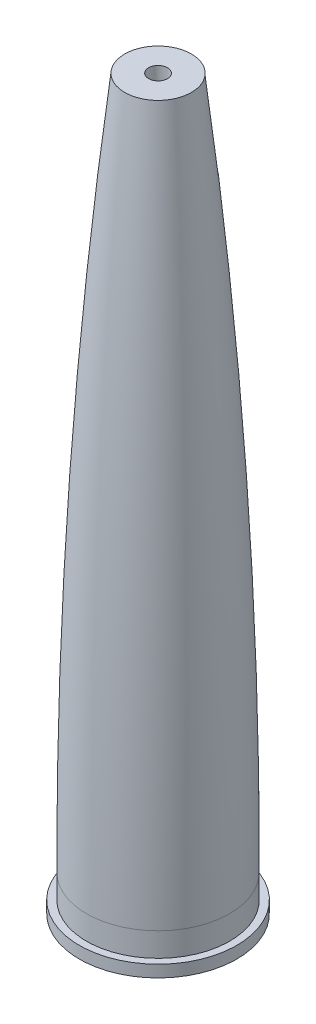
ISO-10303-21;
HEADER;
FILE_DESCRIPTION(('STEP AP214'),'2;1');
FILE_NAME('part.step','',(''),(''),'','','');
FILE_SCHEMA(('AUTOMOTIVE_DESIGN { 1 0 10303 214 1 1 1 1 }'));
ENDSEC;
DATA;
#1=APPLICATION_CONTEXT('core data for automotive mechanical design processes');
#2=APPLICATION_PROTOCOL_DEFINITION('international standard','automotive_design',2000,#1);
#3=PRODUCT_CONTEXT('',#1,'mechanical');
#4=PRODUCT('Part','Part','',(#3));
#5=PRODUCT_RELATED_PRODUCT_CATEGORY('part','',(#4));
#6=PRODUCT_DEFINITION_FORMATION('','',#4);
#7=PRODUCT_DEFINITION_CONTEXT('part definition',#1,'design');
#8=PRODUCT_DEFINITION('design','',#6,#7);
#9=PRODUCT_DEFINITION_SHAPE('','',#8);
#10=(LENGTH_UNIT() NAMED_UNIT(*) SI_UNIT(.MILLI.,.METRE.));
#11=(NAMED_UNIT(*) PLANE_ANGLE_UNIT() SI_UNIT($,.RADIAN.));
#12=(NAMED_UNIT(*) SI_UNIT($,.STERADIAN.) SOLID_ANGLE_UNIT());
#13=UNCERTAINTY_MEASURE_WITH_UNIT(LENGTH_MEASURE(1.E-05),#10,'distance_accuracy_value','');
#14=(GEOMETRIC_REPRESENTATION_CONTEXT(3) GLOBAL_UNCERTAINTY_ASSIGNED_CONTEXT((#13)) GLOBAL_UNIT_ASSIGNED_CONTEXT((#10,
#11,#12)) REPRESENTATION_CONTEXT('',''));
#15=CARTESIAN_POINT('',(0.,0.,0.));
#16=DIRECTION('',(0.,0.,1.));
#17=DIRECTION('',(1.,0.,0.));
#18=AXIS2_PLACEMENT_3D('',#15,#16,#17);
#19=CARTESIAN_POINT('',(-1.02594588578452E-12,469.437670106418,0.));
#20=DIRECTION('',(0.,1.,0.));
#21=DIRECTION('',(0.,0.,1.));
#22=AXIS2_PLACEMENT_3D('',#19,#20,#21);
#23=PLANE('',#22);
#24=CARTESIAN_POINT('',(0.,469.437670106418,0.));
#25=DIRECTION('',(0.,-1.,0.));
#26=DIRECTION('',(0.,0.,-1.));
#27=AXIS2_PLACEMENT_3D('',#24,#25,#26);
#28=CIRCLE('',#27,10.0812105045985);
#29=CARTESIAN_POINT('',(0.,469.437670106418,-10.0812105045985));
#30=VERTEX_POINT('',#29);
#31=EDGE_CURVE('E54',#30,#30,#28,.T.);
#32=ORIENTED_EDGE('',*,*,#31,.T.);
#33=EDGE_LOOP('',(#32));
#34=FACE_BOUND('',#33,.T.);
#35=CARTESIAN_POINT('',(0.,469.437670106418,0.));
#36=DIRECTION('',(0.,-1.,0.));
#37=DIRECTION('',(0.,0.,-1.));
#38=AXIS2_PLACEMENT_3D('',#35,#36,#37);
#39=CIRCLE('',#38,35.4812105045985);
#40=CARTESIAN_POINT('',(0.,469.437670106418,-35.4812105045985));
#41=VERTEX_POINT('',#40);
#42=EDGE_CURVE('E10',#41,#41,#39,.T.);
#43=ORIENTED_EDGE('',*,*,#42,.F.);
#44=EDGE_LOOP('',(#43));
#45=FACE_BOUND('',#44,.T.);
#46=ADVANCED_FACE('F29',(#34,#45),#23,.T.);
#47=CARTESIAN_POINT('',(0.,-256.393087278072,0.));
#48=DIRECTION('',(0.,-1.,0.));
#49=DIRECTION('',(0.,0.,-1.));
#50=AXIS2_PLACEMENT_3D('',#47,#48,#49);
#51=DEGENERATE_TOROIDAL_SURFACE('',#50,6411.86531511049,6488.07425279076,.F.);
#52=CARTESIAN_POINT('',(0.,-267.162329893582,0.));
#53=DIRECTION('',(0.,-1.,0.));
#54=DIRECTION('',(0.,0.,-1.));
#55=AXIS2_PLACEMENT_3D('',#52,#53,#54);
#56=CIRCLE('',#55,76.2);
#57=CARTESIAN_POINT('',(0.,-267.162329893582,-76.2));
#58=VERTEX_POINT('',#57);
#59=EDGE_CURVE('E35',#58,#58,#56,.T.);
#60=ORIENTED_EDGE('',*,*,#59,.F.);
#61=EDGE_LOOP('',(#60));
#62=FACE_BOUND('',#61,.T.);
#63=ORIENTED_EDGE('',*,*,#42,.T.);
#64=EDGE_LOOP('',(#63));
#65=FACE_BOUND('',#64,.T.);
#66=ADVANCED_FACE('F120',(#62,#65),#51,.F.);
#67=CARTESIAN_POINT('',(0.,0.,0.));
#68=DIRECTION('',(0.,-1.,0.));
#69=DIRECTION('',(0.,0.,-1.));
#70=AXIS2_PLACEMENT_3D('',#67,#68,#69);
#71=CYLINDRICAL_SURFACE('',#70,76.2);
#72=ORIENTED_EDGE('',*,*,#59,.T.);
#73=EDGE_LOOP('',(#72));
#74=FACE_BOUND('',#73,.T.);
#75=CARTESIAN_POINT('',(0.,-292.562329893582,0.));
#76=DIRECTION('',(0.,-1.,0.));
#77=DIRECTION('',(0.,0.,-1.));
#78=AXIS2_PLACEMENT_3D('',#75,#76,#77);
#79=CIRCLE('',#78,76.1999999999999);
#80=CARTESIAN_POINT('',(0.,-292.562329893582,-76.1999999999999));
#81=VERTEX_POINT('',#80);
#82=EDGE_CURVE('E39',#81,#81,#79,.T.);
#83=ORIENTED_EDGE('',*,*,#82,.F.);
#84=EDGE_LOOP('',(#83));
#85=FACE_BOUND('',#84,.T.);
#86=ADVANCED_FACE('F117',(#74,#85),#71,.T.);
#87=CARTESIAN_POINT('',(0.,-292.562329893582,0.));
#88=DIRECTION('',(0.,1.,0.));
#89=DIRECTION('',(0.,0.,1.));
#90=AXIS2_PLACEMENT_3D('',#87,#88,#89);
#91=PLANE('',#90);
#92=ORIENTED_EDGE('',*,*,#82,.T.);
#93=EDGE_LOOP('',(#92));
#94=FACE_BOUND('',#93,.T.);
#95=CARTESIAN_POINT('',(0.,-292.562329893582,0.));
#96=DIRECTION('',(0.,-1.,0.));
#97=DIRECTION('',(0.,0.,-1.));
#98=AXIS2_PLACEMENT_3D('',#95,#96,#97);
#99=CIRCLE('',#98,83.8199999999999);
#100=CARTESIAN_POINT('',(0.,-292.562329893582,-83.8199999999999));
#101=VERTEX_POINT('',#100);
#102=EDGE_CURVE('E43',#101,#101,#99,.T.);
#103=ORIENTED_EDGE('',*,*,#102,.F.);
#104=EDGE_LOOP('',(#103));
#105=FACE_BOUND('',#104,.T.);
#106=ADVANCED_FACE('F113',(#94,#105),#91,.T.);
#107=CARTESIAN_POINT('',(0.,0.,0.));
#108=DIRECTION('',(0.,-1.,0.));
#109=DIRECTION('',(0.,0.,-1.));
#110=AXIS2_PLACEMENT_3D('',#107,#108,#109);
#111=CYLINDRICAL_SURFACE('',#110,83.8199999999999);
#112=ORIENTED_EDGE('',*,*,#102,.T.);
#113=EDGE_LOOP('',(#112));
#114=FACE_BOUND('',#113,.T.);
#115=CARTESIAN_POINT('',(0.,-305.262329893582,0.));
#116=DIRECTION('',(0.,-1.,0.));
#117=DIRECTION('',(0.,0.,-1.));
#118=AXIS2_PLACEMENT_3D('',#115,#116,#117);
#119=CIRCLE('',#118,83.8199999999999);
#120=CARTESIAN_POINT('',(0.,-305.262329893582,-83.8199999999999));
#121=VERTEX_POINT('',#120);
#122=EDGE_CURVE('E48',#121,#121,#119,.T.);
#123=ORIENTED_EDGE('',*,*,#122,.F.);
#124=EDGE_LOOP('',(#123));
#125=FACE_BOUND('',#124,.T.);
#126=ADVANCED_FACE('F109',(#114,#125),#111,.T.);
#127=CARTESIAN_POINT('',(-2.29803926480045E-13,-305.262329893582,0.));
#128=DIRECTION('',(0.,1.,0.));
#129=DIRECTION('',(0.,0.,1.));
#130=AXIS2_PLACEMENT_3D('',#127,#128,#129);
#131=PLANE('',#130);
#132=CARTESIAN_POINT('',(0.,-305.262329893582,0.));
#133=DIRECTION('',(0.,-1.,0.));
#134=DIRECTION('',(0.,0.,-1.));
#135=AXIS2_PLACEMENT_3D('',#132,#133,#134);
#136=CIRCLE('',#135,10.0812105045984);
#137=CARTESIAN_POINT('',(0.,-305.262329893582,-10.0812105045984));
#138=VERTEX_POINT('',#137);
#139=EDGE_CURVE('E51',#138,#138,#136,.T.);
#140=ORIENTED_EDGE('',*,*,#139,.F.);
#141=EDGE_LOOP('',(#140));
#142=FACE_BOUND('',#141,.T.);
#143=ORIENTED_EDGE('',*,*,#122,.T.);
#144=EDGE_LOOP('',(#143));
#145=FACE_BOUND('',#144,.T.);
#146=ADVANCED_FACE('F105',(#142,#145),#131,.F.);
#147=CARTESIAN_POINT('',(0.,0.,0.));
#148=DIRECTION('',(0.,-1.,0.));
#149=DIRECTION('',(0.,0.,-1.));
#150=AXIS2_PLACEMENT_3D('',#147,#148,#149);
#151=CYLINDRICAL_SURFACE('',#150,10.0812105045985);
#152=ORIENTED_EDGE('',*,*,#139,.T.);
#153=EDGE_LOOP('',(#152));
#154=FACE_BOUND('',#153,.T.);
#155=ORIENTED_EDGE('',*,*,#31,.F.);
#156=EDGE_LOOP('',(#155));
#157=FACE_BOUND('',#156,.T.);
#158=ADVANCED_FACE('F102',(#154,#157),#151,.F.);
#159=CLOSED_SHELL('',(#46,#66,#86,#106,#126,#146,#158));
#160=CARTESIAN_POINT('',(-1.02039477066139E-12,466.897670106418,0.));
#161=DIRECTION('',(0.,1.,0.));
#162=DIRECTION('',(0.,0.,1.));
#163=AXIS2_PLACEMENT_3D('',#160,#161,#162);
#164=PLANE('',#163);
#165=CARTESIAN_POINT('',(0.,466.897670106418,0.));
#166=DIRECTION('',(0.,-1.,0.));
#167=DIRECTION('',(0.,0.,-1.));
#168=AXIS2_PLACEMENT_3D('',#165,#166,#167);
#169=CIRCLE('',#168,12.6212105045985);
#170=CARTESIAN_POINT('',(0.,466.897670106418,-12.6212105045985));
#171=VERTEX_POINT('',#170);
#172=EDGE_CURVE('E75',#171,#171,#169,.T.);
#173=ORIENTED_EDGE('',*,*,#172,.F.);
#174=EDGE_LOOP('',(#173));
#175=FACE_BOUND('',#174,.T.);
#176=CARTESIAN_POINT('',(0.,466.897670106418,0.));
#177=DIRECTION('',(0.,-1.,0.));
#178=DIRECTION('',(0.,0.,-1.));
#179=AXIS2_PLACEMENT_3D('',#176,#177,#178);
#180=CIRCLE('',#179,33.210714262965);
#181=CARTESIAN_POINT('',(0.,466.897670106418,-33.210714262965));
#182=VERTEX_POINT('',#181);
#183=EDGE_CURVE('E57',#182,#182,#180,.T.);
#184=ORIENTED_EDGE('',*,*,#183,.T.);
#185=EDGE_LOOP('',(#184));
#186=FACE_BOUND('',#185,.T.);
#187=ADVANCED_FACE('F81',(#175,#186),#164,.F.);
#188=CARTESIAN_POINT('',(0.,-256.393087278072,0.));
#189=DIRECTION('',(0.,-1.,0.));
#190=DIRECTION('',(0.,0.,-1.));
#191=AXIS2_PLACEMENT_3D('',#188,#189,#190);
#192=DEGENERATE_TOROIDAL_SURFACE('',#191,6411.86531511049,6485.53425279076,.F.);
#193=CARTESIAN_POINT('',(0.,-267.160221673809,0.));
#194=DIRECTION('',(0.,-1.,0.));
#195=DIRECTION('',(0.,0.,-1.));
#196=AXIS2_PLACEMENT_3D('',#193,#194,#195);
#197=CIRCLE('',#196,73.66);
#198=CARTESIAN_POINT('',(0.,-267.160221673809,-73.66));
#199=VERTEX_POINT('',#198);
#200=EDGE_CURVE('E60',#199,#199,#197,.T.);
#201=ORIENTED_EDGE('',*,*,#200,.T.);
#202=EDGE_LOOP('',(#201));
#203=FACE_BOUND('',#202,.T.);
#204=ORIENTED_EDGE('',*,*,#183,.F.);
#205=EDGE_LOOP('',(#204));
#206=FACE_BOUND('',#205,.T.);
#207=ADVANCED_FACE('F84',(#203,#206),#192,.T.);
#208=CARTESIAN_POINT('',(0.,0.,0.));
#209=DIRECTION('',(0.,-1.,0.));
#210=DIRECTION('',(0.,0.,-1.));
#211=AXIS2_PLACEMENT_3D('',#208,#209,#210);
#212=CYLINDRICAL_SURFACE('',#211,73.66);
#213=ORIENTED_EDGE('',*,*,#200,.F.);
#214=EDGE_LOOP('',(#213));
#215=FACE_BOUND('',#214,.T.);
#216=CARTESIAN_POINT('',(0.,-295.102329893582,0.));
#217=DIRECTION('',(0.,-1.,0.));
#218=DIRECTION('',(0.,0.,-1.));
#219=AXIS2_PLACEMENT_3D('',#216,#217,#218);
#220=CIRCLE('',#219,73.6599999999999);
#221=CARTESIAN_POINT('',(0.,-295.102329893582,-73.6599999999999));
#222=VERTEX_POINT('',#221);
#223=EDGE_CURVE('E63',#222,#222,#220,.T.);
#224=ORIENTED_EDGE('',*,*,#223,.T.);
#225=EDGE_LOOP('',(#224));
#226=FACE_BOUND('',#225,.T.);
#227=ADVANCED_FACE('F90',(#215,#226),#212,.F.);
#228=CARTESIAN_POINT('',(0.,-295.102329893582,0.));
#229=DIRECTION('',(0.,1.,0.));
#230=DIRECTION('',(0.,0.,1.));
#231=AXIS2_PLACEMENT_3D('',#228,#229,#230);
#232=PLANE('',#231);
#233=ORIENTED_EDGE('',*,*,#223,.F.);
#234=EDGE_LOOP('',(#233));
#235=FACE_BOUND('',#234,.T.);
#236=CARTESIAN_POINT('',(0.,-295.102329893582,0.));
#237=DIRECTION('',(0.,-1.,0.));
#238=DIRECTION('',(0.,0.,-1.));
#239=AXIS2_PLACEMENT_3D('',#236,#237,#238);
#240=CIRCLE('',#239,81.2799999999999);
#241=CARTESIAN_POINT('',(0.,-295.102329893582,-81.2799999999999));
#242=VERTEX_POINT('',#241);
#243=EDGE_CURVE('E66',#242,#242,#240,.T.);
#244=ORIENTED_EDGE('',*,*,#243,.T.);
#245=EDGE_LOOP('',(#244));
#246=FACE_BOUND('',#245,.T.);
#247=ADVANCED_FACE('F96',(#235,#246),#232,.F.);
#248=CARTESIAN_POINT('',(0.,0.,0.));
#249=DIRECTION('',(0.,-1.,0.));
#250=DIRECTION('',(0.,0.,-1.));
#251=AXIS2_PLACEMENT_3D('',#248,#249,#250);
#252=CYLINDRICAL_SURFACE('',#251,81.2799999999999);
#253=ORIENTED_EDGE('',*,*,#243,.F.);
#254=EDGE_LOOP('',(#253));
#255=FACE_BOUND('',#254,.T.);
#256=CARTESIAN_POINT('',(0.,-302.722329893582,0.));
#257=DIRECTION('',(0.,-1.,0.));
#258=DIRECTION('',(0.,0.,-1.));
#259=AXIS2_PLACEMENT_3D('',#256,#257,#258);
#260=CIRCLE('',#259,81.2799999999999);
#261=CARTESIAN_POINT('',(0.,-302.722329893582,-81.2799999999999));
#262=VERTEX_POINT('',#261);
#263=EDGE_CURVE('E69',#262,#262,#260,.T.);
#264=ORIENTED_EDGE('',*,*,#263,.T.);
#265=EDGE_LOOP('',(#264));
#266=FACE_BOUND('',#265,.T.);
#267=ADVANCED_FACE('F191',(#255,#266),#252,.F.);
#268=CARTESIAN_POINT('',(-2.27891794139763E-13,-302.722329893582,0.));
#269=DIRECTION('',(0.,1.,0.));
#270=DIRECTION('',(0.,0.,1.));
#271=AXIS2_PLACEMENT_3D('',#268,#269,#270);
#272=PLANE('',#271);
#273=CARTESIAN_POINT('',(0.,-302.722329893582,0.));
#274=DIRECTION('',(0.,-1.,0.));
#275=DIRECTION('',(0.,0.,-1.));
#276=AXIS2_PLACEMENT_3D('',#273,#274,#275);
#277=CIRCLE('',#276,12.6212105045984);
#278=CARTESIAN_POINT('',(0.,-302.722329893582,-12.6212105045984));
#279=VERTEX_POINT('',#278);
#280=EDGE_CURVE('E72',#279,#279,#277,.T.);
#281=ORIENTED_EDGE('',*,*,#280,.T.);
#282=EDGE_LOOP('',(#281));
#283=FACE_BOUND('',#282,.T.);
#284=ORIENTED_EDGE('',*,*,#263,.F.);
#285=EDGE_LOOP('',(#284));
#286=FACE_BOUND('',#285,.T.);
#287=ADVANCED_FACE('F200',(#283,#286),#272,.T.);
#288=CARTESIAN_POINT('',(0.,0.,0.));
#289=DIRECTION('',(0.,-1.,0.));
#290=DIRECTION('',(0.,0.,-1.));
#291=AXIS2_PLACEMENT_3D('',#288,#289,#290);
#292=CYLINDRICAL_SURFACE('',#291,12.6212105045985);
#293=ORIENTED_EDGE('',*,*,#280,.F.);
#294=EDGE_LOOP('',(#293));
#295=FACE_BOUND('',#294,.T.);
#296=ORIENTED_EDGE('',*,*,#172,.T.);
#297=EDGE_LOOP('',(#296));
#298=FACE_BOUND('',#297,.T.);
#299=ADVANCED_FACE('F79',(#295,#298),#292,.T.);
#300=CLOSED_SHELL('',(#187,#207,#227,#247,#267,#287,#299));
#301=ORIENTED_CLOSED_SHELL('',*,#300,.T.);
#302=BREP_WITH_VOIDS('B2',#159,(#301));
#303=ADVANCED_BREP_SHAPE_REPRESENTATION('',(#18,#302),#14);
#304=SHAPE_DEFINITION_REPRESENTATION(#9,#303);
ENDSEC;
END-ISO-10303-21;
